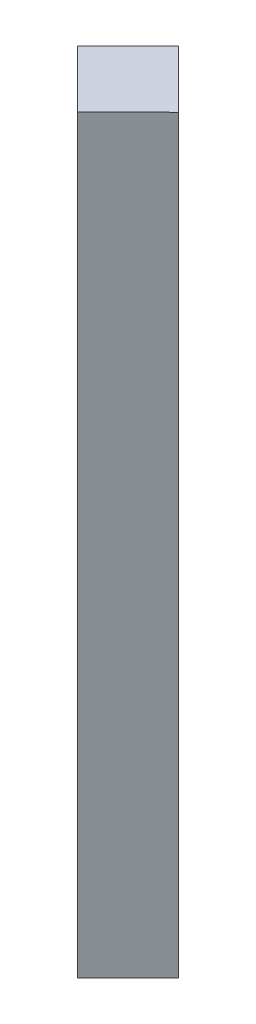
ISO-10303-21;
HEADER;
FILE_DESCRIPTION(('STEP AP214'),'2;1');
FILE_NAME('part.step','',(''),(''),'','','');
FILE_SCHEMA(('AUTOMOTIVE_DESIGN { 1 0 10303 214 1 1 1 1 }'));
ENDSEC;
DATA;
#1=APPLICATION_CONTEXT('core data for automotive mechanical design processes');
#2=APPLICATION_PROTOCOL_DEFINITION('international standard','automotive_design',2000,#1);
#3=PRODUCT_CONTEXT('',#1,'mechanical');
#4=PRODUCT('Part','Part','',(#3));
#5=PRODUCT_RELATED_PRODUCT_CATEGORY('part','',(#4));
#6=PRODUCT_DEFINITION_FORMATION('','',#4);
#7=PRODUCT_DEFINITION_CONTEXT('part definition',#1,'design');
#8=PRODUCT_DEFINITION('design','',#6,#7);
#9=PRODUCT_DEFINITION_SHAPE('','',#8);
#10=(LENGTH_UNIT() NAMED_UNIT(*) SI_UNIT(.MILLI.,.METRE.));
#11=(NAMED_UNIT(*) PLANE_ANGLE_UNIT() SI_UNIT($,.RADIAN.));
#12=(NAMED_UNIT(*) SI_UNIT($,.STERADIAN.) SOLID_ANGLE_UNIT());
#13=UNCERTAINTY_MEASURE_WITH_UNIT(LENGTH_MEASURE(1.E-05),#10,'distance_accuracy_value','');
#14=(GEOMETRIC_REPRESENTATION_CONTEXT(3) GLOBAL_UNCERTAINTY_ASSIGNED_CONTEXT((#13)) GLOBAL_UNIT_ASSIGNED_CONTEXT((#10,
#11,#12)) REPRESENTATION_CONTEXT('',''));
#15=CARTESIAN_POINT('',(0.,0.,0.));
#16=DIRECTION('',(0.,0.,1.));
#17=DIRECTION('',(1.,0.,0.));
#18=AXIS2_PLACEMENT_3D('',#15,#16,#17);
#19=CARTESIAN_POINT('',(2.86340781785955,-25.5999824753701,0.182744818314356));
#20=DIRECTION('',(0.705631540066905,0.,0.708578950903008));
#21=DIRECTION('',(0.708578950903008,0.,-0.705631540066905));
#22=AXIS2_PLACEMENT_3D('',#19,#20,#21);
#23=PLANE('',#22);
#24=DIRECTION('',(-0.708578950903008,0.,0.705631540066905));
#25=VECTOR('',#24,1.);
#26=CARTESIAN_POINT('',(2.86340781785955,-9.5,0.182744818314356));
#27=LINE('',#26,#25);
#28=CARTESIAN_POINT('',(2.86340781785955,-9.5,0.182744818314356));
#29=VERTEX_POINT('',#28);
#30=CARTESIAN_POINT('',(0.170807804428131,-9.5,2.86414467056858));
#31=VERTEX_POINT('',#30);
#32=EDGE_CURVE('E42',#29,#31,#27,.T.);
#33=ORIENTED_EDGE('',*,*,#32,.F.);
#34=DIRECTION('',(0.,1.,0.));
#35=VECTOR('',#34,1.);
#36=CARTESIAN_POINT('',(2.86340781785955,-25.5999824753701,0.182744818314356));
#37=LINE('',#36,#35);
#38=CARTESIAN_POINT('',(2.86340781785955,30.3,0.182744818314356));
#39=VERTEX_POINT('',#38);
#40=EDGE_CURVE('E93',#29,#39,#37,.T.);
#41=ORIENTED_EDGE('',*,*,#40,.T.);
#42=DIRECTION('',(0.708578950903008,0.,-0.705631540066905));
#43=VECTOR('',#42,1.);
#44=CARTESIAN_POINT('',(2.86340781785955,30.3,0.182744818314356));
#45=LINE('',#44,#43);
#46=CARTESIAN_POINT('',(0.170807804428131,30.3,2.86414467056858));
#47=VERTEX_POINT('',#46);
#48=EDGE_CURVE('E88',#47,#39,#45,.T.);
#49=ORIENTED_EDGE('',*,*,#48,.F.);
#50=DIRECTION('',(0.,1.,0.));
#51=VECTOR('',#50,1.);
#52=CARTESIAN_POINT('',(0.170807804428131,-25.5999824753701,2.86414467056858));
#53=LINE('',#52,#51);
#54=EDGE_CURVE('E78',#31,#47,#53,.T.);
#55=ORIENTED_EDGE('',*,*,#54,.F.);
#56=EDGE_LOOP('',(#33,#41,#49,#55));
#57=FACE_BOUND('',#56,.T.);
#58=ADVANCED_FACE('F33',(#57),#23,.T.);
#59=CARTESIAN_POINT('',(0.170807804428131,-25.5999824753701,2.86414467056858));
#60=DIRECTION('',(-0.708578950903008,0.,0.705631540066905));
#61=DIRECTION('',(0.705631540066905,0.,0.708578950903008));
#62=AXIS2_PLACEMENT_3D('',#59,#60,#61);
#63=PLANE('',#62);
#64=DIRECTION('',(-0.705631540066905,0.,-0.708578950903008));
#65=VECTOR('',#64,1.);
#66=CARTESIAN_POINT('',(0.170807804428131,-9.5,2.86414467056858));
#67=LINE('',#66,#65);
#68=CARTESIAN_POINT('',(-2.86340781785956,-9.5,-0.182744818314357));
#69=VERTEX_POINT('',#68);
#70=EDGE_CURVE('E48',#31,#69,#67,.T.);
#71=ORIENTED_EDGE('',*,*,#70,.F.);
#72=ORIENTED_EDGE('',*,*,#54,.T.);
#73=DIRECTION('',(0.705631540066905,0.,0.708578950903008));
#74=VECTOR('',#73,1.);
#75=CARTESIAN_POINT('',(0.170807804428131,30.3,2.86414467056858));
#76=LINE('',#75,#74);
#77=CARTESIAN_POINT('',(-2.86340781785956,30.3,-0.182744818314357));
#78=VERTEX_POINT('',#77);
#79=EDGE_CURVE('E82',#78,#47,#76,.T.);
#80=ORIENTED_EDGE('',*,*,#79,.F.);
#81=DIRECTION('',(0.,1.,0.));
#82=VECTOR('',#81,1.);
#83=CARTESIAN_POINT('',(-2.86340781785956,-25.5999824753701,-0.182744818314357));
#84=LINE('',#83,#82);
#85=EDGE_CURVE('E69',#69,#78,#84,.T.);
#86=ORIENTED_EDGE('',*,*,#85,.F.);
#87=EDGE_LOOP('',(#71,#72,#80,#86));
#88=FACE_BOUND('',#87,.T.);
#89=ADVANCED_FACE('F83',(#88),#63,.T.);
#90=CARTESIAN_POINT('',(-0.170807804428142,-25.5999824753701,-2.86414467056858));
#91=DIRECTION('',(-0.705631540066905,0.,-0.708578950903009));
#92=DIRECTION('',(-0.708578950903009,0.,0.705631540066905));
#93=AXIS2_PLACEMENT_3D('',#90,#91,#92);
#94=PLANE('',#93);
#95=CARTESIAN_POINT('',(-1.51710781114385,22.,-1.52344474444147));
#96=DIRECTION('',(-0.705631540066905,0.,-0.708578950903009));
#97=DIRECTION('',(-0.708578950903009,0.,0.705631540066905));
#98=AXIS2_PLACEMENT_3D('',#95,#96,#97);
#99=CIRCLE('',#98,0.799999999999997);
#100=CARTESIAN_POINT('',(-2.08397097186625,22.,-0.958939512387949));
#101=VERTEX_POINT('',#100);
#102=EDGE_CURVE('E36',#101,#101,#99,.F.);
#103=ORIENTED_EDGE('',*,*,#102,.T.);
#104=EDGE_LOOP('',(#103));
#105=FACE_BOUND('',#104,.T.);
#106=DIRECTION('',(0.708578950903009,0.,-0.705631540066905));
#107=VECTOR('',#106,1.);
#108=CARTESIAN_POINT('',(-0.170807804428142,-9.5,-2.86414467056858));
#109=LINE('',#108,#107);
#110=CARTESIAN_POINT('',(-0.170807804428142,-9.5,-2.86414467056858));
#111=VERTEX_POINT('',#110);
#112=EDGE_CURVE('E76',#69,#111,#109,.T.);
#113=ORIENTED_EDGE('',*,*,#112,.F.);
#114=ORIENTED_EDGE('',*,*,#85,.T.);
#115=DIRECTION('',(-0.708578950903009,0.,0.705631540066905));
#116=VECTOR('',#115,1.);
#117=CARTESIAN_POINT('',(-0.170807804428142,30.3,-2.86414467056858));
#118=LINE('',#117,#116);
#119=CARTESIAN_POINT('',(-0.170807804428142,30.3,-2.86414467056858));
#120=VERTEX_POINT('',#119);
#121=EDGE_CURVE('E74',#120,#78,#118,.T.);
#122=ORIENTED_EDGE('',*,*,#121,.F.);
#123=DIRECTION('',(0.,1.,0.));
#124=VECTOR('',#123,1.);
#125=CARTESIAN_POINT('',(-0.170807804428142,-25.5999824753701,-2.86414467056858));
#126=LINE('',#125,#124);
#127=EDGE_CURVE('E79',#111,#120,#126,.T.);
#128=ORIENTED_EDGE('',*,*,#127,.F.);
#129=EDGE_LOOP('',(#113,#114,#122,#128));
#130=FACE_BOUND('',#129,.T.);
#131=ADVANCED_FACE('F71',(#105,#130),#94,.T.);
#132=CARTESIAN_POINT('',(2.86340781785955,-25.5999824753701,0.182744818314356));
#133=DIRECTION('',(0.708578950903008,0.,-0.705631540066905));
#134=DIRECTION('',(-0.705631540066905,0.,-0.708578950903008));
#135=AXIS2_PLACEMENT_3D('',#132,#133,#134);
#136=PLANE('',#135);
#137=DIRECTION('',(0.705631540066905,0.,0.708578950903008));
#138=VECTOR('',#137,1.);
#139=CARTESIAN_POINT('',(2.86340781785955,-9.5,0.182744818314356));
#140=LINE('',#139,#138);
#141=EDGE_CURVE('E11',#111,#29,#140,.T.);
#142=ORIENTED_EDGE('',*,*,#141,.F.);
#143=ORIENTED_EDGE('',*,*,#127,.T.);
#144=DIRECTION('',(-0.705631540066905,0.,-0.708578950903008));
#145=VECTOR('',#144,1.);
#146=CARTESIAN_POINT('',(2.86340781785955,30.3,0.182744818314356));
#147=LINE('',#146,#145);
#148=EDGE_CURVE('E92',#39,#120,#147,.T.);
#149=ORIENTED_EDGE('',*,*,#148,.F.);
#150=ORIENTED_EDGE('',*,*,#40,.F.);
#151=EDGE_LOOP('',(#142,#143,#149,#150));
#152=FACE_BOUND('',#151,.T.);
#153=ADVANCED_FACE('F108',(#152),#136,.T.);
#154=CARTESIAN_POINT('',(0.550536721492932,-9.5,9.36096632330841));
#155=DIRECTION('',(0.,1.,0.));
#156=DIRECTION('',(0.,0.,1.));
#157=AXIS2_PLACEMENT_3D('',#154,#155,#156);
#158=PLANE('',#157);
#159=CARTESIAN_POINT('',(0.,-9.5,0.));
#160=DIRECTION('',(0.,1.,0.));
#161=DIRECTION('',(0.,0.,1.));
#162=AXIS2_PLACEMENT_3D('',#159,#160,#161);
#163=CIRCLE('',#162,0.799999999999997);
#164=CARTESIAN_POINT('',(0.,-9.5,0.799999999999997));
#165=VERTEX_POINT('',#164);
#166=EDGE_CURVE('E98',#165,#165,#163,.T.);
#167=ORIENTED_EDGE('',*,*,#166,.T.);
#168=EDGE_LOOP('',(#167));
#169=FACE_BOUND('',#168,.T.);
#170=ORIENTED_EDGE('',*,*,#32,.T.);
#171=ORIENTED_EDGE('',*,*,#70,.T.);
#172=ORIENTED_EDGE('',*,*,#112,.T.);
#173=ORIENTED_EDGE('',*,*,#141,.T.);
#174=EDGE_LOOP('',(#170,#171,#172,#173));
#175=FACE_BOUND('',#174,.T.);
#176=ADVANCED_FACE('F111',(#169,#175),#158,.F.);
#177=CARTESIAN_POINT('',(4.06377708367863,30.3,-9.76238347276554));
#178=DIRECTION('',(0.,1.,0.));
#179=DIRECTION('',(0.,0.,1.));
#180=AXIS2_PLACEMENT_3D('',#177,#178,#179);
#181=PLANE('',#180);
#182=ORIENTED_EDGE('',*,*,#79,.T.);
#183=ORIENTED_EDGE('',*,*,#48,.T.);
#184=ORIENTED_EDGE('',*,*,#148,.T.);
#185=ORIENTED_EDGE('',*,*,#121,.T.);
#186=EDGE_LOOP('',(#182,#183,#184,#185));
#187=FACE_BOUND('',#186,.T.);
#188=ADVANCED_FACE('F90',(#187),#181,.T.);
#189=CARTESIAN_POINT('',(0.,-10.5,0.));
#190=DIRECTION('',(0.,1.,0.));
#191=DIRECTION('',(0.,0.,1.));
#192=AXIS2_PLACEMENT_3D('',#189,#190,#191);
#193=CYLINDRICAL_SURFACE('',#192,0.799999999999997);
#194=ORIENTED_EDGE('',*,*,#166,.F.);
#195=EDGE_LOOP('',(#194));
#196=FACE_BOUND('',#195,.T.);
#197=CARTESIAN_POINT('',(0.,20.2,0.));
#198=DIRECTION('',(0.,-1.,0.));
#199=DIRECTION('',(0.,0.,-1.));
#200=AXIS2_PLACEMENT_3D('',#197,#198,#199);
#201=CIRCLE('',#200,0.799999999999997);
#202=CARTESIAN_POINT('',(0.56450523205352,20.2,0.566863160722403));
#203=VERTEX_POINT('',#202);
#204=EDGE_CURVE('E141',#203,#203,#201,.T.);
#205=ORIENTED_EDGE('',*,*,#204,.F.);
#206=EDGE_LOOP('',(#205));
#207=FACE_BOUND('',#206,.T.);
#208=ADVANCED_FACE('F133',(#196,#207),#193,.F.);
#209=CARTESIAN_POINT('',(-1.27013677212043,20.2,-1.27544211162542));
#210=DIRECTION('',(-0.708578950903009,0.,0.705631540066905));
#211=DIRECTION('',(0.705631540066905,0.,0.708578950903009));
#212=AXIS2_PLACEMENT_3D('',#209,#210,#211);
#213=TOROIDAL_SURFACE('',#212,1.8,0.799999999999997);
#214=CARTESIAN_POINT('',(-1.27013677212043,22.,-1.27544211162541));
#215=DIRECTION('',(0.705631540066905,0.,0.708578950903009));
#216=DIRECTION('',(0.499995656384681,-0.708578950903009,-0.497915870337192));
#217=AXIS2_PLACEMENT_3D('',#214,#215,#216);
#218=CIRCLE('',#217,0.799999999999997);
#219=CARTESIAN_POINT('',(-1.27013677212042,22.8,-1.27544211162541));
#220=VERTEX_POINT('',#219);
#221=EDGE_CURVE('E138',#220,#220,#218,.T.);
#222=CARTESIAN_POINT('',(-1.27013677212043,20.2,-1.27544211162542));
#223=DIRECTION('',(-0.708578950903009,0.,0.705631540066905));
#224=DIRECTION('',(0.705631540066905,0.,0.708578950903009));
#225=AXIS2_PLACEMENT_3D('',#222,#223,#224);
#226=CIRCLE('',#225,2.59999999999999);
#227=EDGE_CURVE('',#203,#220,#226,.T.);
#228=ORIENTED_EDGE('',*,*,#204,.T.);
#229=ORIENTED_EDGE('',*,*,#221,.F.);
#230=ORIENTED_EDGE('',*,*,#227,.T.);
#231=ORIENTED_EDGE('',*,*,#227,.F.);
#232=EDGE_LOOP('',(#228,#230,#229,#231));
#233=FACE_BOUND('',#232,.T.);
#234=ADVANCED_FACE('F148',(#233),#213,.F.);
#235=CARTESIAN_POINT('',(-1.27013677212043,22.,-1.27544211162542));
#236=DIRECTION('',(-0.705631540066905,0.,-0.708578950903008));
#237=DIRECTION('',(-0.708578950903009,0.,0.705631540066905));
#238=AXIS2_PLACEMENT_3D('',#235,#236,#237);
#239=CYLINDRICAL_SURFACE('',#238,0.799999999999997);
#240=ORIENTED_EDGE('',*,*,#102,.F.);
#241=EDGE_LOOP('',(#240));
#242=FACE_BOUND('',#241,.T.);
#243=ORIENTED_EDGE('',*,*,#221,.T.);
#244=EDGE_LOOP('',(#243));
#245=FACE_BOUND('',#244,.T.);
#246=ADVANCED_FACE('F134',(#242,#245),#239,.F.);
#247=CLOSED_SHELL('',(#58,#89,#131,#153,#176,#188,#208,#234,#246));
#248=MANIFOLD_SOLID_BREP('B2',#247);
#249=ADVANCED_BREP_SHAPE_REPRESENTATION('',(#18,#248),#14);
#250=SHAPE_DEFINITION_REPRESENTATION(#9,#249);
ENDSEC;
END-ISO-10303-21;
